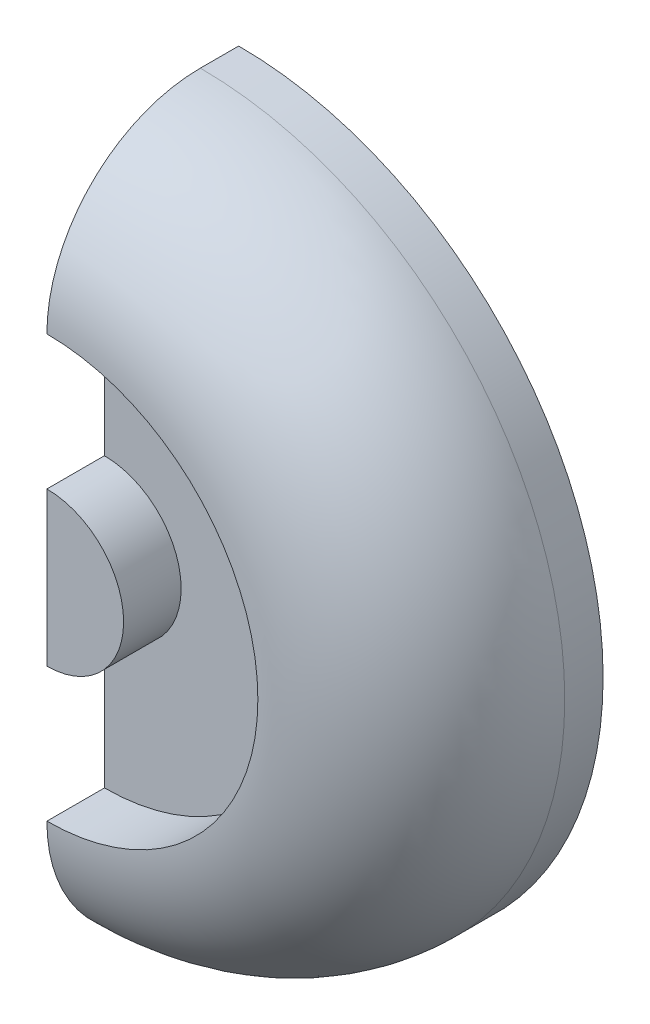
ISO-10303-21;
HEADER;
FILE_DESCRIPTION(('STEP AP214'),'2;1');
FILE_NAME('part.step','',(''),(''),'','','');
FILE_SCHEMA(('AUTOMOTIVE_DESIGN { 1 0 10303 214 1 1 1 1 }'));
ENDSEC;
DATA;
#1=APPLICATION_CONTEXT('core data for automotive mechanical design processes');
#2=APPLICATION_PROTOCOL_DEFINITION('international standard','automotive_design',2000,#1);
#3=PRODUCT_CONTEXT('',#1,'mechanical');
#4=PRODUCT('Part','Part','',(#3));
#5=PRODUCT_RELATED_PRODUCT_CATEGORY('part','',(#4));
#6=PRODUCT_DEFINITION_FORMATION('','',#4);
#7=PRODUCT_DEFINITION_CONTEXT('part definition',#1,'design');
#8=PRODUCT_DEFINITION('design','',#6,#7);
#9=PRODUCT_DEFINITION_SHAPE('','',#8);
#10=(LENGTH_UNIT() NAMED_UNIT(*) SI_UNIT(.MILLI.,.METRE.));
#11=(NAMED_UNIT(*) PLANE_ANGLE_UNIT() SI_UNIT($,.RADIAN.));
#12=(NAMED_UNIT(*) SI_UNIT($,.STERADIAN.) SOLID_ANGLE_UNIT());
#13=UNCERTAINTY_MEASURE_WITH_UNIT(LENGTH_MEASURE(1.E-05),#10,'distance_accuracy_value','');
#14=(GEOMETRIC_REPRESENTATION_CONTEXT(3) GLOBAL_UNCERTAINTY_ASSIGNED_CONTEXT((#13)) GLOBAL_UNIT_ASSIGNED_CONTEXT((#10,
#11,#12)) REPRESENTATION_CONTEXT('',''));
#15=CARTESIAN_POINT('',(0.,0.,0.));
#16=DIRECTION('',(0.,0.,1.));
#17=DIRECTION('',(1.,0.,0.));
#18=AXIS2_PLACEMENT_3D('',#15,#16,#17);
#19=CARTESIAN_POINT('',(-2.96003819728301,0.,27.2185324005155));
#20=DIRECTION('',(0.,0.,-1.));
#21=DIRECTION('',(-1.,0.,0.));
#22=AXIS2_PLACEMENT_3D('',#19,#20,#21);
#23=CYLINDRICAL_SURFACE('',#22,54.625);
#24=CARTESIAN_POINT('',(-2.96003819728301,0.,4.2185324005155));
#25=DIRECTION('',(0.,0.,1.));
#26=DIRECTION('',(1.,0.,0.));
#27=AXIS2_PLACEMENT_3D('',#24,#25,#26);
#28=CIRCLE('',#27,54.625);
#29=CARTESIAN_POINT('',(-2.96003819728301,54.625,4.2185324005155));
#30=VERTEX_POINT('',#29);
#31=CARTESIAN_POINT('',(-2.96003819728301,-54.625,4.21853240051549));
#32=VERTEX_POINT('',#31);
#33=EDGE_CURVE('E44',#30,#32,#28,.F.);
#34=ORIENTED_EDGE('',*,*,#33,.T.);
#35=DIRECTION('',(0.,0.,-1.));
#36=VECTOR('',#35,1.);
#37=CARTESIAN_POINT('',(-2.96003819728301,-54.625,27.2185324005155));
#38=LINE('',#37,#36);
#39=CARTESIAN_POINT('',(-2.96003819728301,-54.625,-1.5314675994845));
#40=VERTEX_POINT('',#39);
#41=EDGE_CURVE('E89',#32,#40,#38,.T.);
#42=ORIENTED_EDGE('',*,*,#41,.T.);
#43=CARTESIAN_POINT('',(-2.96003819728301,0.,-1.5314675994845));
#44=DIRECTION('',(0.,0.,1.));
#45=DIRECTION('',(1.,0.,0.));
#46=AXIS2_PLACEMENT_3D('',#43,#44,#45);
#47=CIRCLE('',#46,54.625);
#48=CARTESIAN_POINT('',(-2.96003819728301,54.625,-1.5314675994845));
#49=VERTEX_POINT('',#48);
#50=EDGE_CURVE('E108',#40,#49,#47,.T.);
#51=ORIENTED_EDGE('',*,*,#50,.T.);
#52=DIRECTION('',(0.,0.,-1.));
#53=VECTOR('',#52,1.);
#54=CARTESIAN_POINT('',(-2.96003819728301,54.625,27.2185324005155));
#55=LINE('',#54,#53);
#56=EDGE_CURVE('E119',#49,#30,#55,.F.);
#57=ORIENTED_EDGE('',*,*,#56,.T.);
#58=EDGE_LOOP('',(#34,#42,#51,#57));
#59=FACE_BOUND('',#58,.T.);
#60=ADVANCED_FACE('F36',(#59),#23,.T.);
#61=CARTESIAN_POINT('',(-2.96003819728301,0.,-1.5314675994845));
#62=DIRECTION('',(0.,0.,1.));
#63=DIRECTION('',(1.,0.,0.));
#64=AXIS2_PLACEMENT_3D('',#61,#62,#63);
#65=PLANE('',#64);
#66=ORIENTED_EDGE('',*,*,#50,.F.);
#67=DIRECTION('',(0.,1.,0.));
#68=VECTOR('',#67,1.);
#69=CARTESIAN_POINT('',(-2.96003819728301,0.,-1.5314675994845));
#70=LINE('',#69,#68);
#71=EDGE_CURVE('E121',#40,#49,#70,.T.);
#72=ORIENTED_EDGE('',*,*,#71,.T.);
#73=EDGE_LOOP('',(#66,#72));
#74=FACE_BOUND('',#73,.T.);
#75=ADVANCED_FACE('F153',(#74),#65,.F.);
#76=CARTESIAN_POINT('',(-2.96003819728301,0.,4.2185324005155));
#77=DIRECTION('',(0.,0.,1.));
#78=DIRECTION('',(1.,0.,0.));
#79=AXIS2_PLACEMENT_3D('',#76,#77,#78);
#80=TOROIDAL_SURFACE('',#79,31.625,23.);
#81=CARTESIAN_POINT('',(-2.96003819728301,31.625,4.2185324005155));
#82=DIRECTION('',(1.,0.,0.));
#83=DIRECTION('',(0.,0.,-1.));
#84=AXIS2_PLACEMENT_3D('',#81,#82,#83);
#85=CIRCLE('',#84,23.);
#86=CARTESIAN_POINT('',(-2.96003819728301,31.625,27.2185324005155));
#87=VERTEX_POINT('',#86);
#88=EDGE_CURVE('E105',#87,#30,#85,.F.);
#89=ORIENTED_EDGE('',*,*,#88,.F.);
#90=CARTESIAN_POINT('',(-2.96003819728301,0.,27.2185324005155));
#91=DIRECTION('',(0.,0.,1.));
#92=DIRECTION('',(1.,0.,0.));
#93=AXIS2_PLACEMENT_3D('',#90,#91,#92);
#94=CIRCLE('',#93,31.625);
#95=CARTESIAN_POINT('',(-2.96003819728301,-31.625,27.2185324005155));
#96=VERTEX_POINT('',#95);
#97=EDGE_CURVE('E100',#96,#87,#94,.T.);
#98=ORIENTED_EDGE('',*,*,#97,.F.);
#99=CARTESIAN_POINT('',(-2.96003819728301,-31.625,4.2185324005155));
#100=DIRECTION('',(1.,0.,0.));
#101=DIRECTION('',(0.,0.,-1.));
#102=AXIS2_PLACEMENT_3D('',#99,#100,#101);
#103=CIRCLE('',#102,23.);
#104=EDGE_CURVE('E84',#32,#96,#103,.F.);
#105=ORIENTED_EDGE('',*,*,#104,.F.);
#106=ORIENTED_EDGE('',*,*,#33,.F.);
#107=EDGE_LOOP('',(#89,#98,#105,#106));
#108=FACE_BOUND('',#107,.T.);
#109=ADVANCED_FACE('F38',(#108),#80,.T.);
#110=CARTESIAN_POINT('',(-2.96003819728301,0.,18.5935324005155));
#111=DIRECTION('',(0.,0.,1.));
#112=DIRECTION('',(1.,0.,0.));
#113=AXIS2_PLACEMENT_3D('',#110,#111,#112);
#114=CYLINDRICAL_SURFACE('',#113,31.625);
#115=ORIENTED_EDGE('',*,*,#97,.T.);
#116=DIRECTION('',(0.,0.,1.));
#117=VECTOR('',#116,1.);
#118=CARTESIAN_POINT('',(-2.96003819728301,31.625,18.5935324005155));
#119=LINE('',#118,#117);
#120=CARTESIAN_POINT('',(-2.96003819728301,31.625,18.5935324005155));
#121=VERTEX_POINT('',#120);
#122=EDGE_CURVE('E124',#87,#121,#119,.F.);
#123=ORIENTED_EDGE('',*,*,#122,.T.);
#124=CARTESIAN_POINT('',(-2.96003819728301,0.,18.5935324005155));
#125=DIRECTION('',(0.,0.,1.));
#126=DIRECTION('',(1.,0.,0.));
#127=AXIS2_PLACEMENT_3D('',#124,#125,#126);
#128=CIRCLE('',#127,31.625);
#129=CARTESIAN_POINT('',(-2.96003819728301,-31.625,18.5935324005155));
#130=VERTEX_POINT('',#129);
#131=EDGE_CURVE('E102',#130,#121,#128,.T.);
#132=ORIENTED_EDGE('',*,*,#131,.F.);
#133=DIRECTION('',(0.,0.,1.));
#134=VECTOR('',#133,1.);
#135=CARTESIAN_POINT('',(-2.96003819728301,-31.625,18.5935324005155));
#136=LINE('',#135,#134);
#137=EDGE_CURVE('E87',#130,#96,#136,.T.);
#138=ORIENTED_EDGE('',*,*,#137,.T.);
#139=EDGE_LOOP('',(#115,#123,#132,#138));
#140=FACE_BOUND('',#139,.T.);
#141=ADVANCED_FACE('F98',(#140),#114,.F.);
#142=CARTESIAN_POINT('',(-2.96003819728301,0.,18.5935324005155));
#143=DIRECTION('',(0.,0.,1.));
#144=DIRECTION('',(1.,0.,0.));
#145=AXIS2_PLACEMENT_3D('',#142,#143,#144);
#146=PLANE('',#145);
#147=DIRECTION('',(0.,1.,0.));
#148=VECTOR('',#147,1.);
#149=CARTESIAN_POINT('',(-2.96003819728301,0.,18.5935324005155));
#150=LINE('',#149,#148);
#151=CARTESIAN_POINT('',(-2.96003819728301,-11.5,18.5935324005155));
#152=VERTEX_POINT('',#151);
#153=EDGE_CURVE('E55',#130,#152,#150,.T.);
#154=ORIENTED_EDGE('',*,*,#153,.F.);
#155=ORIENTED_EDGE('',*,*,#131,.T.);
#156=CARTESIAN_POINT('',(-2.96003819728301,11.5,18.5935324005155));
#157=VERTEX_POINT('',#156);
#158=EDGE_CURVE('E139',#157,#121,#150,.T.);
#159=ORIENTED_EDGE('',*,*,#158,.F.);
#160=CARTESIAN_POINT('',(-2.96003819728301,0.,18.5935324005155));
#161=DIRECTION('',(0.,0.,1.));
#162=DIRECTION('',(1.,0.,0.));
#163=AXIS2_PLACEMENT_3D('',#160,#161,#162);
#164=CIRCLE('',#163,11.5);
#165=EDGE_CURVE('E111',#152,#157,#164,.T.);
#166=ORIENTED_EDGE('',*,*,#165,.F.);
#167=EDGE_LOOP('',(#154,#155,#159,#166));
#168=FACE_BOUND('',#167,.T.);
#169=ADVANCED_FACE('F138',(#168),#146,.T.);
#170=CARTESIAN_POINT('',(-2.96003819728301,0.,27.2185324005155));
#171=DIRECTION('',(0.,0.,-1.));
#172=DIRECTION('',(-1.,0.,0.));
#173=AXIS2_PLACEMENT_3D('',#170,#171,#172);
#174=CYLINDRICAL_SURFACE('',#173,11.5);
#175=CARTESIAN_POINT('',(-2.96003819728301,0.,27.2185324005155));
#176=DIRECTION('',(0.,0.,1.));
#177=DIRECTION('',(1.,0.,0.));
#178=AXIS2_PLACEMENT_3D('',#175,#176,#177);
#179=CIRCLE('',#178,11.5);
#180=CARTESIAN_POINT('',(-2.96003819728301,-11.5,27.2185324005155));
#181=VERTEX_POINT('',#180);
#182=CARTESIAN_POINT('',(-2.96003819728301,11.5,27.2185324005155));
#183=VERTEX_POINT('',#182);
#184=EDGE_CURVE('E106',#181,#183,#179,.T.);
#185=ORIENTED_EDGE('',*,*,#184,.F.);
#186=DIRECTION('',(0.,0.,-1.));
#187=VECTOR('',#186,1.);
#188=CARTESIAN_POINT('',(-2.96003819728301,-11.5,27.2185324005155));
#189=LINE('',#188,#187);
#190=EDGE_CURVE('E50',#181,#152,#189,.T.);
#191=ORIENTED_EDGE('',*,*,#190,.T.);
#192=ORIENTED_EDGE('',*,*,#165,.T.);
#193=DIRECTION('',(0.,0.,-1.));
#194=VECTOR('',#193,1.);
#195=CARTESIAN_POINT('',(-2.96003819728301,11.5,27.2185324005155));
#196=LINE('',#195,#194);
#197=EDGE_CURVE('E135',#157,#183,#196,.F.);
#198=ORIENTED_EDGE('',*,*,#197,.T.);
#199=EDGE_LOOP('',(#185,#191,#192,#198));
#200=FACE_BOUND('',#199,.T.);
#201=ADVANCED_FACE('F134',(#200),#174,.T.);
#202=CARTESIAN_POINT('',(-2.96003819728301,0.,27.2185324005155));
#203=DIRECTION('',(0.,0.,1.));
#204=DIRECTION('',(1.,0.,0.));
#205=AXIS2_PLACEMENT_3D('',#202,#203,#204);
#206=PLANE('',#205);
#207=DIRECTION('',(0.,1.,0.));
#208=VECTOR('',#207,1.);
#209=CARTESIAN_POINT('',(-2.96003819728301,0.,27.2185324005155));
#210=LINE('',#209,#208);
#211=EDGE_CURVE('E11',#181,#183,#210,.T.);
#212=ORIENTED_EDGE('',*,*,#211,.F.);
#213=ORIENTED_EDGE('',*,*,#184,.T.);
#214=EDGE_LOOP('',(#212,#213));
#215=FACE_BOUND('',#214,.T.);
#216=ADVANCED_FACE('F143',(#215),#206,.T.);
#217=CARTESIAN_POINT('',(-2.96003819728301,58.7137065019854,-30.2814675994845));
#218=DIRECTION('',(1.,0.,0.));
#219=DIRECTION('',(0.,0.,-1.));
#220=AXIS2_PLACEMENT_3D('',#217,#218,#219);
#221=PLANE('',#220);
#222=ORIENTED_EDGE('',*,*,#211,.T.);
#223=ORIENTED_EDGE('',*,*,#197,.F.);
#224=ORIENTED_EDGE('',*,*,#158,.T.);
#225=ORIENTED_EDGE('',*,*,#122,.F.);
#226=ORIENTED_EDGE('',*,*,#88,.T.);
#227=ORIENTED_EDGE('',*,*,#56,.F.);
#228=ORIENTED_EDGE('',*,*,#71,.F.);
#229=ORIENTED_EDGE('',*,*,#41,.F.);
#230=ORIENTED_EDGE('',*,*,#104,.T.);
#231=ORIENTED_EDGE('',*,*,#137,.F.);
#232=ORIENTED_EDGE('',*,*,#153,.T.);
#233=ORIENTED_EDGE('',*,*,#190,.F.);
#234=EDGE_LOOP('',(#222,#223,#224,#225,#226,#227,#228,#229,#230,#231,#232,#233));
#235=FACE_BOUND('',#234,.T.);
#236=ADVANCED_FACE('F86',(#235),#221,.F.);
#237=CLOSED_SHELL('',(#60,#75,#109,#141,#169,#201,#216,#236));
#238=MANIFOLD_SOLID_BREP('B2',#237);
#239=ADVANCED_BREP_SHAPE_REPRESENTATION('',(#18,#238),#14);
#240=SHAPE_DEFINITION_REPRESENTATION(#9,#239);
ENDSEC;
END-ISO-10303-21;
